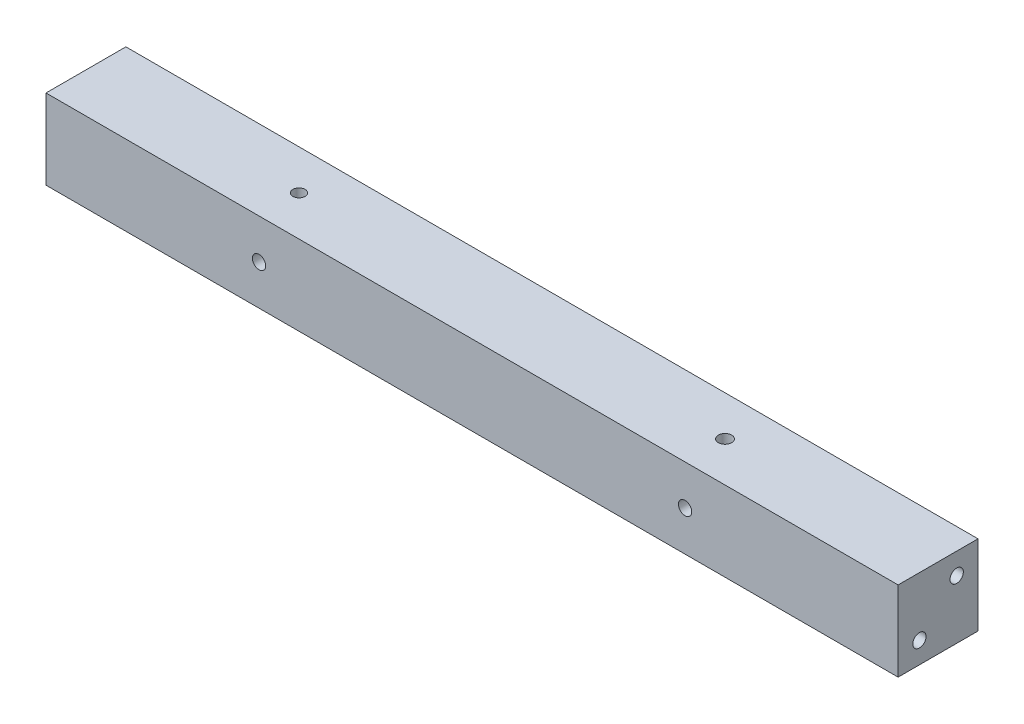
ISO-10303-21;
HEADER;
FILE_DESCRIPTION(('STEP AP214'),'2;1');
FILE_NAME('part.step','',(''),(''),'','','');
FILE_SCHEMA(('AUTOMOTIVE_DESIGN { 1 0 10303 214 1 1 1 1 }'));
ENDSEC;
DATA;
#1=APPLICATION_CONTEXT('core data for automotive mechanical design processes');
#2=APPLICATION_PROTOCOL_DEFINITION('international standard','automotive_design',2000,#1);
#3=PRODUCT_CONTEXT('',#1,'mechanical');
#4=PRODUCT('Part','Part','',(#3));
#5=PRODUCT_RELATED_PRODUCT_CATEGORY('part','',(#4));
#6=PRODUCT_DEFINITION_FORMATION('','',#4);
#7=PRODUCT_DEFINITION_CONTEXT('part definition',#1,'design');
#8=PRODUCT_DEFINITION('design','',#6,#7);
#9=PRODUCT_DEFINITION_SHAPE('','',#8);
#10=(LENGTH_UNIT() NAMED_UNIT(*) SI_UNIT(.MILLI.,.METRE.));
#11=(NAMED_UNIT(*) PLANE_ANGLE_UNIT() SI_UNIT($,.RADIAN.));
#12=(NAMED_UNIT(*) SI_UNIT($,.STERADIAN.) SOLID_ANGLE_UNIT());
#13=UNCERTAINTY_MEASURE_WITH_UNIT(LENGTH_MEASURE(1.E-05),#10,'distance_accuracy_value','');
#14=(GEOMETRIC_REPRESENTATION_CONTEXT(3) GLOBAL_UNCERTAINTY_ASSIGNED_CONTEXT((#13)) GLOBAL_UNIT_ASSIGNED_CONTEXT((#10,
#11,#12)) REPRESENTATION_CONTEXT('',''));
#15=CARTESIAN_POINT('',(0.,0.,0.));
#16=DIRECTION('',(0.,0.,1.));
#17=DIRECTION('',(1.,0.,0.));
#18=AXIS2_PLACEMENT_3D('',#15,#16,#17);
#19=CARTESIAN_POINT('',(120.,7.5,0.));
#20=DIRECTION('',(0.,0.,1.));
#21=DIRECTION('',(1.,0.,0.));
#22=AXIS2_PLACEMENT_3D('',#19,#20,#21);
#23=CYLINDRICAL_SURFACE('',#22,1.25);
#24=CARTESIAN_POINT('',(120.,7.5,15.));
#25=DIRECTION('',(0.,0.,1.));
#26=DIRECTION('',(1.,0.,0.));
#27=AXIS2_PLACEMENT_3D('',#24,#25,#26);
#28=CIRCLE('',#27,1.25);
#29=CARTESIAN_POINT('',(121.25,7.5,15.));
#30=VERTEX_POINT('',#29);
#31=EDGE_CURVE('E117',#30,#30,#28,.T.);
#32=ORIENTED_EDGE('',*,*,#31,.T.);
#33=EDGE_LOOP('',(#32));
#34=FACE_BOUND('',#33,.T.);
#35=CARTESIAN_POINT('',(120.,7.5,7.5));
#36=DIRECTION('',(0.,-0.707106781186547,0.707106781186547));
#37=DIRECTION('',(0.,0.707106781186547,0.707106781186547));
#38=AXIS2_PLACEMENT_3D('',#35,#36,#37);
#39=ELLIPSE('',#38,1.76776695296637,1.25);
#40=CARTESIAN_POINT('',(118.75,7.5,7.5));
#41=VERTEX_POINT('',#40);
#42=CARTESIAN_POINT('',(121.25,7.5,7.5));
#43=VERTEX_POINT('',#42);
#44=EDGE_CURVE('E53',#41,#43,#39,.F.);
#45=ORIENTED_EDGE('',*,*,#44,.T.);
#46=CARTESIAN_POINT('',(120.,7.5,7.5));
#47=DIRECTION('',(0.,0.707106781186547,0.707106781186547));
#48=DIRECTION('',(0.,-0.707106781186547,0.707106781186547));
#49=AXIS2_PLACEMENT_3D('',#46,#47,#48);
#50=ELLIPSE('',#49,1.76776695296637,1.25);
#51=EDGE_CURVE('E11',#43,#41,#50,.F.);
#52=ORIENTED_EDGE('',*,*,#51,.T.);
#53=EDGE_LOOP('',(#45,#52));
#54=FACE_BOUND('',#53,.T.);
#55=ADVANCED_FACE('F40',(#34,#54),#23,.F.);
#56=CARTESIAN_POINT('',(0.,0.,15.));
#57=DIRECTION('',(1.,0.,0.));
#58=DIRECTION('',(0.,0.,-1.));
#59=AXIS2_PLACEMENT_3D('',#56,#57,#58);
#60=PLANE('',#59);
#61=CARTESIAN_POINT('',(0.,11.,4.));
#62=DIRECTION('',(-1.,0.,0.));
#63=DIRECTION('',(0.,0.,1.));
#64=AXIS2_PLACEMENT_3D('',#61,#62,#63);
#65=CIRCLE('',#64,1.25);
#66=CARTESIAN_POINT('',(0.,11.,5.25));
#67=VERTEX_POINT('',#66);
#68=EDGE_CURVE('E251',#67,#67,#65,.T.);
#69=ORIENTED_EDGE('',*,*,#68,.F.);
#70=EDGE_LOOP('',(#69));
#71=FACE_BOUND('',#70,.T.);
#72=CARTESIAN_POINT('',(0.,4.,11.));
#73=DIRECTION('',(-1.,0.,0.));
#74=DIRECTION('',(0.,0.,1.));
#75=AXIS2_PLACEMENT_3D('',#72,#73,#74);
#76=CIRCLE('',#75,1.25);
#77=CARTESIAN_POINT('',(0.,4.,12.25));
#78=VERTEX_POINT('',#77);
#79=EDGE_CURVE('E244',#78,#78,#76,.T.);
#80=ORIENTED_EDGE('',*,*,#79,.F.);
#81=EDGE_LOOP('',(#80));
#82=FACE_BOUND('',#81,.T.);
#83=DIRECTION('',(0.,-1.,0.));
#84=VECTOR('',#83,1.);
#85=CARTESIAN_POINT('',(0.,0.,0.));
#86=LINE('',#85,#84);
#87=CARTESIAN_POINT('',(0.,15.,0.));
#88=VERTEX_POINT('',#87);
#89=CARTESIAN_POINT('',(0.,0.,0.));
#90=VERTEX_POINT('',#89);
#91=EDGE_CURVE('E201',#88,#90,#86,.T.);
#92=ORIENTED_EDGE('',*,*,#91,.T.);
#93=DIRECTION('',(0.,0.,-1.));
#94=VECTOR('',#93,1.);
#95=CARTESIAN_POINT('',(0.,0.,15.));
#96=LINE('',#95,#94);
#97=CARTESIAN_POINT('',(0.,0.,15.));
#98=VERTEX_POINT('',#97);
#99=EDGE_CURVE('E104',#98,#90,#96,.T.);
#100=ORIENTED_EDGE('',*,*,#99,.F.);
#101=DIRECTION('',(0.,-1.,0.));
#102=VECTOR('',#101,1.);
#103=CARTESIAN_POINT('',(0.,0.,15.));
#104=LINE('',#103,#102);
#105=CARTESIAN_POINT('',(0.,15.,15.));
#106=VERTEX_POINT('',#105);
#107=EDGE_CURVE('E209',#106,#98,#104,.T.);
#108=ORIENTED_EDGE('',*,*,#107,.F.);
#109=DIRECTION('',(0.,0.,-1.));
#110=VECTOR('',#109,1.);
#111=CARTESIAN_POINT('',(0.,15.,15.));
#112=LINE('',#111,#110);
#113=EDGE_CURVE('E213',#106,#88,#112,.T.);
#114=ORIENTED_EDGE('',*,*,#113,.T.);
#115=EDGE_LOOP('',(#92,#100,#108,#114));
#116=FACE_BOUND('',#115,.T.);
#117=ADVANCED_FACE('F42',(#71,#82,#116),#60,.F.);
#118=CARTESIAN_POINT('',(0.,0.,15.));
#119=DIRECTION('',(0.,1.,0.));
#120=DIRECTION('',(0.,0.,1.));
#121=AXIS2_PLACEMENT_3D('',#118,#119,#120);
#122=PLANE('',#121);
#123=CARTESIAN_POINT('',(40.,0.,7.5));
#124=DIRECTION('',(0.,1.,0.));
#125=DIRECTION('',(0.,0.,1.));
#126=AXIS2_PLACEMENT_3D('',#123,#124,#125);
#127=CIRCLE('',#126,1.145);
#128=CARTESIAN_POINT('',(40.,0.,8.645));
#129=VERTEX_POINT('',#128);
#130=EDGE_CURVE('E188',#129,#129,#127,.T.);
#131=ORIENTED_EDGE('',*,*,#130,.T.);
#132=EDGE_LOOP('',(#131));
#133=FACE_BOUND('',#132,.T.);
#134=CARTESIAN_POINT('',(120.,0.,7.5));
#135=DIRECTION('',(0.,1.,0.));
#136=DIRECTION('',(0.,0.,1.));
#137=AXIS2_PLACEMENT_3D('',#134,#135,#136);
#138=CIRCLE('',#137,1.25);
#139=CARTESIAN_POINT('',(120.,0.,8.75));
#140=VERTEX_POINT('',#139);
#141=EDGE_CURVE('E190',#140,#140,#138,.T.);
#142=ORIENTED_EDGE('',*,*,#141,.T.);
#143=EDGE_LOOP('',(#142));
#144=FACE_BOUND('',#143,.T.);
#145=DIRECTION('',(1.,0.,0.));
#146=VECTOR('',#145,1.);
#147=CARTESIAN_POINT('',(0.,0.,0.));
#148=LINE('',#147,#146);
#149=CARTESIAN_POINT('',(160.,0.,0.));
#150=VERTEX_POINT('',#149);
#151=EDGE_CURVE('E191',#90,#150,#148,.T.);
#152=ORIENTED_EDGE('',*,*,#151,.T.);
#153=DIRECTION('',(0.,0.,-1.));
#154=VECTOR('',#153,1.);
#155=CARTESIAN_POINT('',(160.,0.,15.));
#156=LINE('',#155,#154);
#157=CARTESIAN_POINT('',(160.,0.,15.));
#158=VERTEX_POINT('',#157);
#159=EDGE_CURVE('E193',#158,#150,#156,.T.);
#160=ORIENTED_EDGE('',*,*,#159,.F.);
#161=DIRECTION('',(1.,0.,0.));
#162=VECTOR('',#161,1.);
#163=CARTESIAN_POINT('',(0.,0.,15.));
#164=LINE('',#163,#162);
#165=EDGE_CURVE('E91',#98,#158,#164,.T.);
#166=ORIENTED_EDGE('',*,*,#165,.F.);
#167=ORIENTED_EDGE('',*,*,#99,.T.);
#168=EDGE_LOOP('',(#152,#160,#166,#167));
#169=FACE_BOUND('',#168,.T.);
#170=ADVANCED_FACE('F153',(#133,#144,#169),#122,.F.);
#171=CARTESIAN_POINT('',(160.,0.,15.));
#172=DIRECTION('',(-1.,0.,0.));
#173=DIRECTION('',(0.,0.,1.));
#174=AXIS2_PLACEMENT_3D('',#171,#172,#173);
#175=PLANE('',#174);
#176=CARTESIAN_POINT('',(160.,11.,4.));
#177=DIRECTION('',(1.,0.,0.));
#178=DIRECTION('',(0.,0.,-1.));
#179=AXIS2_PLACEMENT_3D('',#176,#177,#178);
#180=CIRCLE('',#179,1.25);
#181=CARTESIAN_POINT('',(160.,11.,2.75));
#182=VERTEX_POINT('',#181);
#183=EDGE_CURVE('E262',#182,#182,#180,.T.);
#184=ORIENTED_EDGE('',*,*,#183,.F.);
#185=EDGE_LOOP('',(#184));
#186=FACE_BOUND('',#185,.T.);
#187=CARTESIAN_POINT('',(160.,4.,11.));
#188=DIRECTION('',(1.,0.,0.));
#189=DIRECTION('',(0.,0.,-1.));
#190=AXIS2_PLACEMENT_3D('',#187,#188,#189);
#191=CIRCLE('',#190,1.25);
#192=CARTESIAN_POINT('',(160.,4.,9.75));
#193=VERTEX_POINT('',#192);
#194=EDGE_CURVE('E256',#193,#193,#191,.T.);
#195=ORIENTED_EDGE('',*,*,#194,.F.);
#196=EDGE_LOOP('',(#195));
#197=FACE_BOUND('',#196,.T.);
#198=DIRECTION('',(0.,1.,0.));
#199=VECTOR('',#198,1.);
#200=CARTESIAN_POINT('',(160.,0.,0.));
#201=LINE('',#200,#199);
#202=CARTESIAN_POINT('',(160.,15.,0.));
#203=VERTEX_POINT('',#202);
#204=EDGE_CURVE('E200',#150,#203,#201,.T.);
#205=ORIENTED_EDGE('',*,*,#204,.T.);
#206=DIRECTION('',(0.,0.,-1.));
#207=VECTOR('',#206,1.);
#208=CARTESIAN_POINT('',(160.,15.,15.));
#209=LINE('',#208,#207);
#210=CARTESIAN_POINT('',(160.,15.,15.));
#211=VERTEX_POINT('',#210);
#212=EDGE_CURVE('E206',#211,#203,#209,.T.);
#213=ORIENTED_EDGE('',*,*,#212,.F.);
#214=DIRECTION('',(0.,1.,0.));
#215=VECTOR('',#214,1.);
#216=CARTESIAN_POINT('',(160.,0.,15.));
#217=LINE('',#216,#215);
#218=EDGE_CURVE('E205',#158,#211,#217,.T.);
#219=ORIENTED_EDGE('',*,*,#218,.F.);
#220=ORIENTED_EDGE('',*,*,#159,.T.);
#221=EDGE_LOOP('',(#205,#213,#219,#220));
#222=FACE_BOUND('',#221,.T.);
#223=ADVANCED_FACE('F177',(#186,#197,#222),#175,.F.);
#224=CARTESIAN_POINT('',(0.,15.,15.));
#225=DIRECTION('',(0.,-1.,0.));
#226=DIRECTION('',(0.,0.,-1.));
#227=AXIS2_PLACEMENT_3D('',#224,#225,#226);
#228=PLANE('',#227);
#229=CARTESIAN_POINT('',(40.,15.,7.5));
#230=DIRECTION('',(0.,1.,0.));
#231=DIRECTION('',(0.,0.,1.));
#232=AXIS2_PLACEMENT_3D('',#229,#230,#231);
#233=CIRCLE('',#232,1.145);
#234=CARTESIAN_POINT('',(40.,15.,8.645));
#235=VERTEX_POINT('',#234);
#236=EDGE_CURVE('E240',#235,#235,#233,.T.);
#237=ORIENTED_EDGE('',*,*,#236,.F.);
#238=EDGE_LOOP('',(#237));
#239=FACE_BOUND('',#238,.T.);
#240=CARTESIAN_POINT('',(120.,15.,7.5));
#241=DIRECTION('',(0.,1.,0.));
#242=DIRECTION('',(0.,0.,1.));
#243=AXIS2_PLACEMENT_3D('',#240,#241,#242);
#244=CIRCLE('',#243,1.25);
#245=CARTESIAN_POINT('',(120.,15.,8.75));
#246=VERTEX_POINT('',#245);
#247=EDGE_CURVE('E228',#246,#246,#244,.T.);
#248=ORIENTED_EDGE('',*,*,#247,.F.);
#249=EDGE_LOOP('',(#248));
#250=FACE_BOUND('',#249,.T.);
#251=DIRECTION('',(-1.,0.,0.));
#252=VECTOR('',#251,1.);
#253=CARTESIAN_POINT('',(0.,15.,0.));
#254=LINE('',#253,#252);
#255=EDGE_CURVE('E83',#203,#88,#254,.T.);
#256=ORIENTED_EDGE('',*,*,#255,.T.);
#257=ORIENTED_EDGE('',*,*,#113,.F.);
#258=DIRECTION('',(-1.,0.,0.));
#259=VECTOR('',#258,1.);
#260=CARTESIAN_POINT('',(0.,15.,15.));
#261=LINE('',#260,#259);
#262=EDGE_CURVE('E62',#211,#106,#261,.T.);
#263=ORIENTED_EDGE('',*,*,#262,.F.);
#264=ORIENTED_EDGE('',*,*,#212,.T.);
#265=EDGE_LOOP('',(#256,#257,#263,#264));
#266=FACE_BOUND('',#265,.T.);
#267=ADVANCED_FACE('F170',(#239,#250,#266),#228,.F.);
#268=CARTESIAN_POINT('',(0.,0.,15.));
#269=DIRECTION('',(0.,0.,-1.));
#270=DIRECTION('',(-1.,0.,0.));
#271=AXIS2_PLACEMENT_3D('',#268,#269,#270);
#272=PLANE('',#271);
#273=CARTESIAN_POINT('',(40.,7.5,15.));
#274=DIRECTION('',(0.,0.,1.));
#275=DIRECTION('',(1.,0.,0.));
#276=AXIS2_PLACEMENT_3D('',#273,#274,#275);
#277=CIRCLE('',#276,1.25000000000001);
#278=CARTESIAN_POINT('',(41.25,7.5,15.));
#279=VERTEX_POINT('',#278);
#280=EDGE_CURVE('E221',#279,#279,#277,.T.);
#281=ORIENTED_EDGE('',*,*,#280,.F.);
#282=EDGE_LOOP('',(#281));
#283=FACE_BOUND('',#282,.T.);
#284=ORIENTED_EDGE('',*,*,#31,.F.);
#285=EDGE_LOOP('',(#284));
#286=FACE_BOUND('',#285,.T.);
#287=ORIENTED_EDGE('',*,*,#107,.T.);
#288=ORIENTED_EDGE('',*,*,#165,.T.);
#289=ORIENTED_EDGE('',*,*,#218,.T.);
#290=ORIENTED_EDGE('',*,*,#262,.T.);
#291=EDGE_LOOP('',(#287,#288,#289,#290));
#292=FACE_BOUND('',#291,.T.);
#293=ADVANCED_FACE('F164',(#283,#286,#292),#272,.F.);
#294=CARTESIAN_POINT('',(0.,0.,0.));
#295=DIRECTION('',(0.,0.,-1.));
#296=DIRECTION('',(-1.,0.,0.));
#297=AXIS2_PLACEMENT_3D('',#294,#295,#296);
#298=PLANE('',#297);
#299=CARTESIAN_POINT('',(40.,7.5,0.));
#300=DIRECTION('',(0.,0.,1.));
#301=DIRECTION('',(1.,0.,0.));
#302=AXIS2_PLACEMENT_3D('',#299,#300,#301);
#303=CIRCLE('',#302,1.25000000000001);
#304=CARTESIAN_POINT('',(41.25,7.5,0.));
#305=VERTEX_POINT('',#304);
#306=EDGE_CURVE('E219',#305,#305,#303,.T.);
#307=ORIENTED_EDGE('',*,*,#306,.T.);
#308=EDGE_LOOP('',(#307));
#309=FACE_BOUND('',#308,.T.);
#310=CARTESIAN_POINT('',(120.,7.5,0.));
#311=DIRECTION('',(0.,0.,1.));
#312=DIRECTION('',(1.,0.,0.));
#313=AXIS2_PLACEMENT_3D('',#310,#311,#312);
#314=CIRCLE('',#313,1.25);
#315=CARTESIAN_POINT('',(121.25,7.5,0.));
#316=VERTEX_POINT('',#315);
#317=EDGE_CURVE('E225',#316,#316,#314,.T.);
#318=ORIENTED_EDGE('',*,*,#317,.T.);
#319=EDGE_LOOP('',(#318));
#320=FACE_BOUND('',#319,.T.);
#321=ORIENTED_EDGE('',*,*,#91,.F.);
#322=ORIENTED_EDGE('',*,*,#255,.F.);
#323=ORIENTED_EDGE('',*,*,#204,.F.);
#324=ORIENTED_EDGE('',*,*,#151,.F.);
#325=EDGE_LOOP('',(#321,#322,#323,#324));
#326=FACE_BOUND('',#325,.T.);
#327=ADVANCED_FACE('F158',(#309,#320,#326),#298,.T.);
#328=CARTESIAN_POINT('',(120.,7.5,7.5));
#329=DIRECTION('',(0.,-0.707106781186547,0.707106781186547));
#330=DIRECTION('',(0.,0.707106781186547,0.707106781186547));
#331=AXIS2_PLACEMENT_3D('',#328,#329,#330);
#332=ELLIPSE('',#331,1.76776695296637,1.25);
#333=EDGE_CURVE('E97',#41,#43,#332,.T.);
#334=ORIENTED_EDGE('',*,*,#333,.T.);
#335=CARTESIAN_POINT('',(120.,7.5,7.5));
#336=DIRECTION('',(0.,0.707106781186547,0.707106781186547));
#337=DIRECTION('',(0.,-0.707106781186547,0.707106781186547));
#338=AXIS2_PLACEMENT_3D('',#335,#336,#337);
#339=ELLIPSE('',#338,1.76776695296637,1.25);
#340=EDGE_CURVE('E48',#43,#41,#339,.T.);
#341=ORIENTED_EDGE('',*,*,#340,.T.);
#342=EDGE_LOOP('',(#334,#341));
#343=FACE_BOUND('',#342,.T.);
#344=ORIENTED_EDGE('',*,*,#317,.F.);
#345=EDGE_LOOP('',(#344));
#346=FACE_BOUND('',#345,.T.);
#347=ADVANCED_FACE('F106',(#343,#346),#23,.F.);
#348=CARTESIAN_POINT('',(40.,7.5,0.));
#349=DIRECTION('',(0.,0.,1.));
#350=DIRECTION('',(1.,0.,0.));
#351=AXIS2_PLACEMENT_3D('',#348,#349,#350);
#352=CYLINDRICAL_SURFACE('',#351,1.25000000000001);
#353=CARTESIAN_POINT('',(40.,6.25,8.645));
#354=CARTESIAN_POINT('',(39.9472401217322,6.25000242953519,8.64499753972406));
#355=CARTESIAN_POINT('',(39.8944621024817,6.25336896586556,8.64132496899781));
#356=CARTESIAN_POINT('',(39.7906991540145,6.26653495183679,8.6269291121712));
#357=CARTESIAN_POINT('',(39.7397156706223,6.27633946885662,8.61620027202184));
#358=CARTESIAN_POINT('',(39.6413085539227,6.30149846795534,8.58856027316295));
#359=CARTESIAN_POINT('',(39.5938644269778,6.31681742076215,8.57168868414288));
#360=CARTESIAN_POINT('',(39.5030244245169,6.35200471006577,8.53270915308287));
#361=CARTESIAN_POINT('',(39.4596302688888,6.3718749670884,8.51059900037656));
#362=CARTESIAN_POINT('',(39.360758416355,6.42384191041332,8.45230318628723));
#363=CARTESIAN_POINT('',(39.3074121674083,6.45764638060866,8.41402843967277));
#364=CARTESIAN_POINT('',(39.2095580517728,6.52973772979913,8.33088495453555));
#365=CARTESIAN_POINT('',(39.1650718032831,6.56803521879123,8.28600054125879));
#366=CARTESIAN_POINT('',(39.0837650753719,6.64774797497101,8.18964511783417));
#367=CARTESIAN_POINT('',(39.047158508821,6.68921656368363,8.13803994613549));
#368=CARTESIAN_POINT('',(38.982755753933,6.77170503142999,8.02937691222659));
#369=CARTESIAN_POINT('',(38.954941468144,6.81272566214213,7.9723305692189));
#370=CARTESIAN_POINT('',(38.9202324547965,6.86984569600509,7.88226170391788));
#371=CARTESIAN_POINT('',(38.9099067897385,6.88797742216477,7.85184100888654));
#372=CARTESIAN_POINT('',(38.8915787821573,6.92184010861976,7.78896653564071));
#373=CARTESIAN_POINT('',(38.8835762700495,6.93757124411264,7.75651290603593));
#374=CARTESIAN_POINT('',(38.8713541256471,6.96257965221139,7.69492480275016));
#375=CARTESIAN_POINT('',(38.866726028382,6.9724958927517,7.66614049377992));
#376=CARTESIAN_POINT('',(38.8596463582002,6.98797658923061,7.60720454749161));
#377=CARTESIAN_POINT('',(38.8571871561893,6.99355629066058,7.57705809818295));
#378=CARTESIAN_POINT('',(38.8546957985021,6.999209649152,7.5157880493616));
#379=CARTESIAN_POINT('',(38.8546896700763,6.99922426020858,7.48465747600903));
#380=CARTESIAN_POINT('',(38.8571731123374,6.99358754367646,7.42299484116451));
#381=CARTESIAN_POINT('',(38.8596679743427,6.9879242033041,7.39246418855061));
#382=CARTESIAN_POINT('',(38.8678901732201,6.9699568849336,7.32436788336747));
#383=CARTESIAN_POINT('',(38.8743384205295,6.9562159956849,7.28729035340462));
#384=CARTESIAN_POINT('',(38.8902509986558,6.92443618704079,7.21567885973651));
#385=CARTESIAN_POINT('',(38.8997277311448,6.90637967314913,7.1811560865307));
#386=CARTESIAN_POINT('',(38.9212980181857,6.8680301791695,7.11444967215541));
#387=CARTESIAN_POINT('',(38.933382243533,6.84774529567236,7.08225822454661));
#388=CARTESIAN_POINT('',(38.9600499151448,6.80601106527541,7.01970395440932));
#389=CARTESIAN_POINT('',(38.9746355261237,6.78456072085627,6.98934274679953));
#390=CARTESIAN_POINT('',(39.0221082630459,6.71955390410701,6.90061040865345));
#391=CARTESIAN_POINT('',(39.0586980183801,6.67536703398244,6.84463049270608));
#392=CARTESIAN_POINT('',(39.1450692065905,6.58579078275608,6.73492153170699));
#393=CARTESIAN_POINT('',(39.1956347944803,6.54056018507204,6.68167701425736));
#394=CARTESIAN_POINT('',(39.3088454669008,6.45608738997382,6.58410241786701));
#395=CARTESIAN_POINT('',(39.3714454240478,6.41682377229381,6.53974026165697));
#396=CARTESIAN_POINT('',(39.483337120979,6.36073356794838,6.4769807287626));
#397=CARTESIAN_POINT('',(39.529151915259,6.34094731667728,6.45501527961386));
#398=CARTESIAN_POINT('',(39.6249816954192,6.30649873870799,6.41693160523639));
#399=CARTESIAN_POINT('',(39.674993671564,6.29183277861658,6.40080923340991));
#400=CARTESIAN_POINT('',(39.7785408228491,6.26862309111473,6.37534824444983));
#401=CARTESIAN_POINT('',(39.8320997550022,6.260126440132,6.36606178314783));
#402=CARTESIAN_POINT('',(39.9406395969404,6.25022446685726,6.35524284323627));
#403=CARTESIAN_POINT('',(39.9956196347984,6.24881489540298,6.35370571839709));
#404=CARTESIAN_POINT('',(40.0987114049392,6.25295804818238,6.35822991461346));
#405=CARTESIAN_POINT('',(40.146895622811,6.25774013303434,6.36345016646929));
#406=CARTESIAN_POINT('',(40.2414149326557,6.2726010012877,6.37971246394155));
#407=CARTESIAN_POINT('',(40.2877497885464,6.28268045861809,6.3907552502984));
#408=CARTESIAN_POINT('',(40.3783113204841,6.30767987527394,6.418248781119));
#409=CARTESIAN_POINT('',(40.422487938116,6.32268021855561,6.43478939778045));
#410=CARTESIAN_POINT('',(40.5072134819596,6.35661831996107,6.47242411694128));
#411=CARTESIAN_POINT('',(40.5477607308933,6.37555788525762,6.49352030954478));
#412=CARTESIAN_POINT('',(40.6441079424652,6.42673476798701,6.55096252763162));
#413=CARTESIAN_POINT('',(40.6974760376874,6.46090350231048,6.58967747122862));
#414=CARTESIAN_POINT('',(40.7952855296963,6.53368806132151,6.67372729564309));
#415=CARTESIAN_POINT('',(40.8397023572708,6.57231568017346,6.71907982236986));
#416=CARTESIAN_POINT('',(40.920779586263,6.65266197832555,6.81640461183197));
#417=CARTESIAN_POINT('',(40.9572303872059,6.69443232407773,6.86850866159624));
#418=CARTESIAN_POINT('',(41.0052002981029,6.75652183508645,6.95081917140174));
#419=CARTESIAN_POINT('',(41.0200654309015,6.77711144912993,6.97892975337835));
#420=CARTESIAN_POINT('',(41.0475693862057,6.81758208159835,7.0366992469503));
#421=CARTESIAN_POINT('',(41.0602095188281,6.83746351147531,7.06635723397965));
#422=CARTESIAN_POINT('',(41.0827404012055,6.87499369671283,7.12625978903746));
#423=CARTESIAN_POINT('',(41.092720385749,6.89269975667985,7.15643431556958));
#424=CARTESIAN_POINT('',(41.1103997296799,6.92566503834844,7.21877631421714));
#425=CARTESIAN_POINT('',(41.1180995492208,6.94092475345435,7.25094338263688));
#426=CARTESIAN_POINT('',(41.1298113286102,6.96504512531544,7.31198791950313));
#427=CARTESIAN_POINT('',(41.1342232657178,6.97454749226514,7.34052526965736));
#428=CARTESIAN_POINT('',(41.1409033128704,6.98920975745408,7.39890019954194));
#429=CARTESIAN_POINT('',(41.1431787005855,6.99438439050156,7.42873300055267));
#430=CARTESIAN_POINT('',(41.1453522429074,6.99932232735933,7.48925395526818));
#431=CARTESIAN_POINT('',(41.1452274018213,6.99903328619667,7.51994756682443));
#432=CARTESIAN_POINT('',(41.1425595740828,6.99298321107726,7.5807041812731));
#433=CARTESIAN_POINT('',(41.1400112799976,6.98721016702566,7.61076565203212));
#434=CARTESIAN_POINT('',(41.1316384576284,6.96894475813247,7.67871192867762));
#435=CARTESIAN_POINT('',(41.1250322491857,6.95490398950313,7.71606135760527));
#436=CARTESIAN_POINT('',(41.1087639109748,6.92252988005523,7.78817547586975));
#437=CARTESIAN_POINT('',(41.0990892487171,6.90417901670789,7.82292882982023));
#438=CARTESIAN_POINT('',(41.0770928492866,6.86527985363089,7.89004488869755));
#439=CARTESIAN_POINT('',(41.0647828683334,6.84474151037639,7.92241737994123));
#440=CARTESIAN_POINT('',(41.0376249560927,6.80252742040815,7.98531679811404));
#441=CARTESIAN_POINT('',(41.0227748449377,6.78085070794385,8.01584210912964));
#442=CARTESIAN_POINT('',(40.974443873798,6.71520640134389,8.10503930750022));
#443=CARTESIAN_POINT('',(40.9371959897608,6.67065053152893,8.16129201416944));
#444=CARTESIAN_POINT('',(40.8494343798602,6.58064296462385,8.27121431777935));
#445=CARTESIAN_POINT('',(40.7981666089677,6.53535222693917,8.32441702772689));
#446=CARTESIAN_POINT('',(40.683417820953,6.45096760263753,8.42172382180475));
#447=CARTESIAN_POINT('',(40.619983019832,6.41185125640218,8.46586106720263));
#448=CARTESIAN_POINT('',(40.5071401997118,6.35646619210916,8.52776669618065));
#449=CARTESIAN_POINT('',(40.4612699987499,6.33710698722262,8.54924079715265));
#450=CARTESIAN_POINT('',(40.3654498724821,6.30354261756781,8.58632336371378));
#451=CARTESIAN_POINT('',(40.3155058057989,6.28933020589851,8.60194007786603));
#452=CARTESIAN_POINT('',(40.2214735938602,6.26900365449522,8.62423028036273));
#453=CARTESIAN_POINT('',(40.1778495353824,6.26191884890525,8.63197802143613));
#454=CARTESIAN_POINT('',(40.0894879616512,6.25241611678477,8.64236378725761));
#455=CARTESIAN_POINT('',(40.0447505064061,6.24999793928769,8.64500208678635));
#456=CARTESIAN_POINT('',(40.,6.25,8.645));
#457=B_SPLINE_CURVE_WITH_KNOTS('',3,(#353,#354,#355,#356,#357,#358,#359,#360,#361,#362,#363,
#364,#365,#366,#367,#368,#369,#370,#371,#372,#373,#374,#375,#376,#377,#378,#379,#380,#381,#382,
#383,#384,#385,#386,#387,#388,#389,#390,#391,#392,#393,#394,#395,#396,#397,#398,#399,#400,#401,
#402,#403,#404,#405,#406,#407,#408,#409,#410,#411,#412,#413,#414,#415,#416,#417,#418,#419,#420,
#421,#422,#423,#424,#425,#426,#427,#428,#429,#430,#431,#432,#433,#434,#435,#436,#437,#438,#439,
#440,#441,#442,#443,#444,#445,#446,#447,#448,#449,#450,#451,#452,#453,#454,#455,#456),
.UNSPECIFIED.,.T.,.F.,(4,2,2,2,2,2,2,2,2,2,2,2,2,2,2,2,2,2,2,2,2,2,2,2,2,2,2,2,2,2,2,2,2,2,2,2,
2,2,2,2,2,2,2,2,2,2,2,2,2,2,2,4),(0.,0.158087238274767,0.316299057500942,0.473509252674253,
0.630785908860554,0.85112444205138,1.0719941814548,1.29826173562651,1.52406047631174,
1.63459472692154,1.74512090676621,1.83719855826936,1.92895101960319,2.02167695424864,
2.11459948306359,2.23412320577711,2.35414278978322,2.47373987934299,2.59344099610676,
2.83298917545941,3.09052202678348,3.34710736287121,3.51008211591093,3.67294098477943,
3.83702988928976,4.0010204001535,4.14643311175877,4.29186432717384,4.43980049463522,
4.58780468015724,4.80934880878223,5.03149298349572,5.25892054486218,5.37249397821892,
5.48600031232022,5.59500003693805,5.70397774962068,5.7948681685103,5.88544785459896,
5.97689577947838,6.06854444029665,6.18920102569295,6.31035689629481,6.43098314958719,
6.55171344506635,6.79332227016612,7.05208340891982,7.30988045109727,7.47195272526674,
7.63379589932177,7.76789144106949,7.90197977109245),.UNSPECIFIED.);
#458=CARTESIAN_POINT('',(40.,6.25,8.645));
#459=VERTEX_POINT('',#458);
#460=EDGE_CURVE('E109',#459,#459,#457,.T.);
#461=ORIENTED_EDGE('',*,*,#460,.T.);
#462=EDGE_LOOP('',(#461));
#463=FACE_BOUND('',#462,.T.);
#464=CARTESIAN_POINT('',(40.,8.75,8.645));
#465=CARTESIAN_POINT('',(40.0527598782678,8.74999757046481,8.64499753972406));
#466=CARTESIAN_POINT('',(40.1055378975183,8.74663103413444,8.64132496899781));
#467=CARTESIAN_POINT('',(40.2093008459855,8.73346504816321,8.6269291121712));
#468=CARTESIAN_POINT('',(40.2602843293777,8.72366053114338,8.61620027202184));
#469=CARTESIAN_POINT('',(40.3586914460773,8.69850153204466,8.58856027316295));
#470=CARTESIAN_POINT('',(40.4061355730222,8.68318257923785,8.57168868414288));
#471=CARTESIAN_POINT('',(40.4969755754831,8.64799528993423,8.53270915308287));
#472=CARTESIAN_POINT('',(40.5403697311112,8.6281250329116,8.51059900037656));
#473=CARTESIAN_POINT('',(40.639241583645,8.57615808958668,8.45230318628723));
#474=CARTESIAN_POINT('',(40.6925878325917,8.54235361939134,8.41402843967277));
#475=CARTESIAN_POINT('',(40.7904419482272,8.47026227020087,8.33088495453555));
#476=CARTESIAN_POINT('',(40.8349281967169,8.43196478120876,8.28600054125879));
#477=CARTESIAN_POINT('',(40.9162349246281,8.35225202502899,8.18964511783416));
#478=CARTESIAN_POINT('',(40.952841491179,8.31078343631636,8.13803994613549));
#479=CARTESIAN_POINT('',(41.017244246067,8.22829496857,8.02937691222658));
#480=CARTESIAN_POINT('',(41.045058531856,8.18727433785786,7.97233056921889));
#481=CARTESIAN_POINT('',(41.0797675452035,8.13015430399491,7.88226170391787));
#482=CARTESIAN_POINT('',(41.0900932102615,8.11202257783523,7.85184100888654));
#483=CARTESIAN_POINT('',(41.1084212178427,8.07815989138023,7.78896653564071));
#484=CARTESIAN_POINT('',(41.1164237299505,8.06242875588735,7.75651290603593));
#485=CARTESIAN_POINT('',(41.1286458743529,8.03742034778861,7.69492480275015));
#486=CARTESIAN_POINT('',(41.133273971618,8.02750410724829,7.66614049377992));
#487=CARTESIAN_POINT('',(41.1403536417998,8.01202341076939,7.60720454749161));
#488=CARTESIAN_POINT('',(41.1428128438107,8.00644370933941,7.57705809818294));
#489=CARTESIAN_POINT('',(41.1453042014979,8.00079035084799,7.5157880493616));
#490=CARTESIAN_POINT('',(41.1453103299237,8.00077573979142,7.48465747600902));
#491=CARTESIAN_POINT('',(41.1428268876626,8.00641245632354,7.42299484116451));
#492=CARTESIAN_POINT('',(41.1403320256573,8.0120757966959,7.39246418855061));
#493=CARTESIAN_POINT('',(41.1321098267799,8.0300431150664,7.32436788336747));
#494=CARTESIAN_POINT('',(41.1256615794705,8.0437840043151,7.28729035340462));
#495=CARTESIAN_POINT('',(41.1097490013442,8.07556381295921,7.2156788597365));
#496=CARTESIAN_POINT('',(41.1002722688552,8.09362032685087,7.1811560865307));
#497=CARTESIAN_POINT('',(41.0787019818143,8.13196982083051,7.11444967215541));
#498=CARTESIAN_POINT('',(41.066617756467,8.15225470432765,7.0822582245466));
#499=CARTESIAN_POINT('',(41.0399500848552,8.19398893472459,7.01970395440932));
#500=CARTESIAN_POINT('',(41.0253644738763,8.21543927914373,6.98934274679953));
#501=CARTESIAN_POINT('',(40.9778917369542,8.28044609589299,6.90061040865345));
#502=CARTESIAN_POINT('',(40.9413019816199,8.32463296601757,6.84463049270607));
#503=CARTESIAN_POINT('',(40.8549307934095,8.41420921724392,6.73492153170699));
#504=CARTESIAN_POINT('',(40.8043652055197,8.45943981492796,6.68167701425736));
#505=CARTESIAN_POINT('',(40.6911545330992,8.54391261002618,6.584102417867));
#506=CARTESIAN_POINT('',(40.6285545759522,8.58317622770619,6.53974026165697));
#507=CARTESIAN_POINT('',(40.516662879021,8.63926643205162,6.4769807287626));
#508=CARTESIAN_POINT('',(40.470848084741,8.65905268332273,6.45501527961386));
#509=CARTESIAN_POINT('',(40.3750183045808,8.69350126129202,6.41693160523638));
#510=CARTESIAN_POINT('',(40.325006328436,8.70816722138342,6.40080923340991));
#511=CARTESIAN_POINT('',(40.2214591771509,8.73137690888527,6.37534824444982));
#512=CARTESIAN_POINT('',(40.1679002449978,8.739873559868,6.36606178314783));
#513=CARTESIAN_POINT('',(40.0593604030596,8.74977553314274,6.35524284323627));
#514=CARTESIAN_POINT('',(40.0043803652016,8.75118510459702,6.35370571839709));
#515=CARTESIAN_POINT('',(39.9012885950608,8.74704195181762,6.35822991461346));
#516=CARTESIAN_POINT('',(39.853104377189,8.74225986696566,6.36345016646929));
#517=CARTESIAN_POINT('',(39.7585850673443,8.7273989987123,6.37971246394155));
#518=CARTESIAN_POINT('',(39.7122502114536,8.71731954138191,6.3907552502984));
#519=CARTESIAN_POINT('',(39.6216886795159,8.69232012472606,6.41824878111901));
#520=CARTESIAN_POINT('',(39.577512061884,8.67731978144439,6.43478939778046));
#521=CARTESIAN_POINT('',(39.4927865180404,8.64338168003892,6.47242411694128));
#522=CARTESIAN_POINT('',(39.4522392691067,8.62444211474238,6.49352030954479));
#523=CARTESIAN_POINT('',(39.3558920575348,8.57326523201298,6.55096252763163));
#524=CARTESIAN_POINT('',(39.3025239623126,8.53909649768951,6.58967747122862));
#525=CARTESIAN_POINT('',(39.2047144703037,8.46631193867848,6.6737272956431));
#526=CARTESIAN_POINT('',(39.1602976427292,8.42768431982653,6.71907982236988));
#527=CARTESIAN_POINT('',(39.079220413737,8.34733802167443,6.81640461183198));
#528=CARTESIAN_POINT('',(39.0427696127941,8.30556767592226,6.86850866159626));
#529=CARTESIAN_POINT('',(38.9947997018971,8.24347816491354,6.95081917140175));
#530=CARTESIAN_POINT('',(38.9799345690985,8.22288855087006,6.97892975337837));
#531=CARTESIAN_POINT('',(38.9524306137943,8.18241791840164,7.03669924695032));
#532=CARTESIAN_POINT('',(38.9397904811719,8.16253648852467,7.06635723397967));
#533=CARTESIAN_POINT('',(38.9172595987945,8.12500630328716,7.12625978903747));
#534=CARTESIAN_POINT('',(38.907279614251,8.10730024332014,7.1564343155696));
#535=CARTESIAN_POINT('',(38.8896002703201,8.07433496165156,7.21877631421716));
#536=CARTESIAN_POINT('',(38.8819004507792,8.05907524654564,7.25094338263689));
#537=CARTESIAN_POINT('',(38.8701886713897,8.03495487468455,7.31198791950314));
#538=CARTESIAN_POINT('',(38.8657767342822,8.02545250773485,7.34052526965738));
#539=CARTESIAN_POINT('',(38.8590966871296,8.01079024254592,7.39890019954195));
#540=CARTESIAN_POINT('',(38.8568212994145,8.00561560949844,7.42873300055268));
#541=CARTESIAN_POINT('',(38.8546477570926,8.00067767264067,7.48925395526819));
#542=CARTESIAN_POINT('',(38.8547725981787,8.00096671380333,7.51994756682444));
#543=CARTESIAN_POINT('',(38.8574404259172,8.00701678892274,7.58070418127311));
#544=CARTESIAN_POINT('',(38.8599887200024,8.01278983297434,7.61076565203212));
#545=CARTESIAN_POINT('',(38.8683615423716,8.03105524186753,7.67871192867762));
#546=CARTESIAN_POINT('',(38.8749677508143,8.04509601049687,7.71606135760527));
#547=CARTESIAN_POINT('',(38.8912360890252,8.07747011994477,7.78817547586975));
#548=CARTESIAN_POINT('',(38.9009107512829,8.09582098329211,7.82292882982023));
#549=CARTESIAN_POINT('',(38.9229071507134,8.13472014636911,7.89004488869755));
#550=CARTESIAN_POINT('',(38.9352171316666,8.15525848962361,7.92241737994123));
#551=CARTESIAN_POINT('',(38.9623750439073,8.19747257959185,7.98531679811404));
#552=CARTESIAN_POINT('',(38.9772251550623,8.21914929205615,8.01584210912964));
#553=CARTESIAN_POINT('',(39.025556126202,8.28479359865612,8.10503930750022));
#554=CARTESIAN_POINT('',(39.0628040102392,8.32934946847107,8.16129201416944));
#555=CARTESIAN_POINT('',(39.1505656201398,8.41935703537615,8.27121431777936));
#556=CARTESIAN_POINT('',(39.2018333910323,8.46464777306084,8.3244170277269));
#557=CARTESIAN_POINT('',(39.316582179047,8.54903239736248,8.42172382180476));
#558=CARTESIAN_POINT('',(39.380016980168,8.58814874359783,8.46586106720264));
#559=CARTESIAN_POINT('',(39.4928598002882,8.64353380789085,8.52776669618066));
#560=CARTESIAN_POINT('',(39.5387300012501,8.66289301277739,8.54924079715265));
#561=CARTESIAN_POINT('',(39.634550127518,8.69645738243219,8.58632336371378));
#562=CARTESIAN_POINT('',(39.6844941942011,8.71066979410149,8.60194007786603));
#563=CARTESIAN_POINT('',(39.7785264061398,8.73099634550478,8.62423028036273));
#564=CARTESIAN_POINT('',(39.8221504646176,8.73808115109475,8.63197802143613));
#565=CARTESIAN_POINT('',(39.9105120383488,8.74758388321523,8.64236378725761));
#566=CARTESIAN_POINT('',(39.9552494935939,8.75000206071231,8.64500208678635));
#567=CARTESIAN_POINT('',(40.,8.75,8.645));
#568=B_SPLINE_CURVE_WITH_KNOTS('',3,(#464,#465,#466,#467,#468,#469,#470,#471,#472,#473,#474,
#475,#476,#477,#478,#479,#480,#481,#482,#483,#484,#485,#486,#487,#488,#489,#490,#491,#492,#493,
#494,#495,#496,#497,#498,#499,#500,#501,#502,#503,#504,#505,#506,#507,#508,#509,#510,#511,#512,
#513,#514,#515,#516,#517,#518,#519,#520,#521,#522,#523,#524,#525,#526,#527,#528,#529,#530,#531,
#532,#533,#534,#535,#536,#537,#538,#539,#540,#541,#542,#543,#544,#545,#546,#547,#548,#549,#550,
#551,#552,#553,#554,#555,#556,#557,#558,#559,#560,#561,#562,#563,#564,#565,#566,#567),
.UNSPECIFIED.,.T.,.F.,(4,2,2,2,2,2,2,2,2,2,2,2,2,2,2,2,2,2,2,2,2,2,2,2,2,2,2,2,2,2,2,2,2,2,2,2,
2,2,2,2,2,2,2,2,2,2,2,2,2,2,2,4),(0.,0.158087238274767,0.316299057500942,0.473509252674252,
0.630785908860554,0.851124442051382,1.07199418145482,1.29826173562652,1.52406047631175,
1.63459472692155,1.74512090676621,1.83719855826937,1.92895101960319,2.02167695424864,
2.11459948306359,2.23412320577711,2.35414278978322,2.47373987934299,2.59344099610677,
2.83298917545942,3.09052202678348,3.34710736287122,3.51008211591094,3.67294098477943,
3.83702988928977,4.00102040015351,4.14643311175877,4.29186432717384,4.43980049463523,
4.58780468015725,4.80934880878225,5.03149298349574,5.2589205448622,5.37249397821895,
5.48600031232025,5.59500003693808,5.7039777496207,5.79486816851032,5.88544785459897,
5.97689577947839,6.06854444029665,6.18920102569295,6.31035689629482,6.43098314958719,
6.55171344506635,6.79332227016613,7.05208340891984,7.30988045109728,7.47195272526676,
7.63379589932178,7.76789144106949,7.90197977109245),.UNSPECIFIED.);
#569=CARTESIAN_POINT('',(40.,8.75,8.645));
#570=VERTEX_POINT('',#569);
#571=EDGE_CURVE('E118',#570,#570,#568,.T.);
#572=ORIENTED_EDGE('',*,*,#571,.T.);
#573=EDGE_LOOP('',(#572));
#574=FACE_BOUND('',#573,.T.);
#575=ORIENTED_EDGE('',*,*,#306,.F.);
#576=EDGE_LOOP('',(#575));
#577=FACE_BOUND('',#576,.T.);
#578=ORIENTED_EDGE('',*,*,#280,.T.);
#579=EDGE_LOOP('',(#578));
#580=FACE_BOUND('',#579,.T.);
#581=ADVANCED_FACE('F123',(#463,#574,#577,#580),#352,.F.);
#582=CARTESIAN_POINT('',(40.,0.,7.5));
#583=DIRECTION('',(0.,1.,0.));
#584=DIRECTION('',(0.,0.,1.));
#585=AXIS2_PLACEMENT_3D('',#582,#583,#584);
#586=CYLINDRICAL_SURFACE('',#585,1.145);
#587=ORIENTED_EDGE('',*,*,#236,.T.);
#588=EDGE_LOOP('',(#587));
#589=FACE_BOUND('',#588,.T.);
#590=ORIENTED_EDGE('',*,*,#571,.F.);
#591=EDGE_LOOP('',(#590));
#592=FACE_BOUND('',#591,.T.);
#593=ADVANCED_FACE('F131',(#589,#592),#586,.F.);
#594=ORIENTED_EDGE('',*,*,#130,.F.);
#595=EDGE_LOOP('',(#594));
#596=FACE_BOUND('',#595,.T.);
#597=ORIENTED_EDGE('',*,*,#460,.F.);
#598=EDGE_LOOP('',(#597));
#599=FACE_BOUND('',#598,.T.);
#600=ADVANCED_FACE('F127',(#596,#599),#586,.F.);
#601=CARTESIAN_POINT('',(120.,0.,7.5));
#602=DIRECTION('',(0.,1.,0.));
#603=DIRECTION('',(0.,0.,1.));
#604=AXIS2_PLACEMENT_3D('',#601,#602,#603);
#605=CYLINDRICAL_SURFACE('',#604,1.25);
#606=ORIENTED_EDGE('',*,*,#247,.T.);
#607=EDGE_LOOP('',(#606));
#608=FACE_BOUND('',#607,.T.);
#609=ORIENTED_EDGE('',*,*,#44,.F.);
#610=ORIENTED_EDGE('',*,*,#340,.F.);
#611=EDGE_LOOP('',(#609,#610));
#612=FACE_BOUND('',#611,.T.);
#613=ADVANCED_FACE('F103',(#608,#612),#605,.F.);
#614=ORIENTED_EDGE('',*,*,#141,.F.);
#615=EDGE_LOOP('',(#614));
#616=FACE_BOUND('',#615,.T.);
#617=ORIENTED_EDGE('',*,*,#333,.F.);
#618=ORIENTED_EDGE('',*,*,#51,.F.);
#619=EDGE_LOOP('',(#617,#618));
#620=FACE_BOUND('',#619,.T.);
#621=ADVANCED_FACE('F98',(#616,#620),#605,.F.);
#622=CARTESIAN_POINT('',(10.,4.,11.));
#623=DIRECTION('',(-1.,0.,0.));
#624=DIRECTION('',(0.,0.,1.));
#625=AXIS2_PLACEMENT_3D('',#622,#623,#624);
#626=CYLINDRICAL_SURFACE('',#625,1.25);
#627=CARTESIAN_POINT('',(10.,4.,11.));
#628=DIRECTION('',(-1.,0.,0.));
#629=DIRECTION('',(0.,0.,1.));
#630=AXIS2_PLACEMENT_3D('',#627,#628,#629);
#631=CIRCLE('',#630,1.25);
#632=CARTESIAN_POINT('',(10.,4.,12.25));
#633=VERTEX_POINT('',#632);
#634=EDGE_CURVE('E247',#633,#633,#631,.T.);
#635=ORIENTED_EDGE('',*,*,#634,.F.);
#636=EDGE_LOOP('',(#635));
#637=FACE_BOUND('',#636,.T.);
#638=ORIENTED_EDGE('',*,*,#79,.T.);
#639=EDGE_LOOP('',(#638));
#640=FACE_BOUND('',#639,.T.);
#641=ADVANCED_FACE('F133',(#637,#640),#626,.F.);
#642=CARTESIAN_POINT('',(10.,4.,11.));
#643=DIRECTION('',(-1.,0.,0.));
#644=DIRECTION('',(0.,0.,1.));
#645=AXIS2_PLACEMENT_3D('',#642,#643,#644);
#646=PLANE('',#645);
#647=ORIENTED_EDGE('',*,*,#634,.T.);
#648=EDGE_LOOP('',(#647));
#649=FACE_BOUND('',#648,.T.);
#650=ADVANCED_FACE('F143',(#649),#646,.T.);
#651=CARTESIAN_POINT('',(10.,11.,4.));
#652=DIRECTION('',(-1.,0.,0.));
#653=DIRECTION('',(0.,0.,1.));
#654=AXIS2_PLACEMENT_3D('',#651,#652,#653);
#655=CYLINDRICAL_SURFACE('',#654,1.25);
#656=CARTESIAN_POINT('',(10.,11.,4.));
#657=DIRECTION('',(-1.,0.,0.));
#658=DIRECTION('',(0.,0.,1.));
#659=AXIS2_PLACEMENT_3D('',#656,#657,#658);
#660=CIRCLE('',#659,1.25);
#661=CARTESIAN_POINT('',(10.,11.,5.25));
#662=VERTEX_POINT('',#661);
#663=EDGE_CURVE('E238',#662,#662,#660,.T.);
#664=ORIENTED_EDGE('',*,*,#663,.F.);
#665=EDGE_LOOP('',(#664));
#666=FACE_BOUND('',#665,.T.);
#667=ORIENTED_EDGE('',*,*,#68,.T.);
#668=EDGE_LOOP('',(#667));
#669=FACE_BOUND('',#668,.T.);
#670=ADVANCED_FACE('F290',(#666,#669),#655,.F.);
#671=CARTESIAN_POINT('',(10.,11.,4.));
#672=DIRECTION('',(-1.,0.,0.));
#673=DIRECTION('',(0.,0.,1.));
#674=AXIS2_PLACEMENT_3D('',#671,#672,#673);
#675=PLANE('',#674);
#676=ORIENTED_EDGE('',*,*,#663,.T.);
#677=EDGE_LOOP('',(#676));
#678=FACE_BOUND('',#677,.T.);
#679=ADVANCED_FACE('F281',(#678),#675,.T.);
#680=CARTESIAN_POINT('',(150.,4.,11.));
#681=DIRECTION('',(1.,0.,0.));
#682=DIRECTION('',(0.,0.,-1.));
#683=AXIS2_PLACEMENT_3D('',#680,#681,#682);
#684=CYLINDRICAL_SURFACE('',#683,1.25);
#685=CARTESIAN_POINT('',(150.,4.,11.));
#686=DIRECTION('',(1.,0.,0.));
#687=DIRECTION('',(0.,0.,-1.));
#688=AXIS2_PLACEMENT_3D('',#685,#686,#687);
#689=CIRCLE('',#688,1.25);
#690=CARTESIAN_POINT('',(150.,4.,9.75));
#691=VERTEX_POINT('',#690);
#692=EDGE_CURVE('E259',#691,#691,#689,.T.);
#693=ORIENTED_EDGE('',*,*,#692,.F.);
#694=EDGE_LOOP('',(#693));
#695=FACE_BOUND('',#694,.T.);
#696=ORIENTED_EDGE('',*,*,#194,.T.);
#697=EDGE_LOOP('',(#696));
#698=FACE_BOUND('',#697,.T.);
#699=ADVANCED_FACE('F279',(#695,#698),#684,.F.);
#700=CARTESIAN_POINT('',(150.,4.,11.));
#701=DIRECTION('',(1.,0.,0.));
#702=DIRECTION('',(0.,0.,-1.));
#703=AXIS2_PLACEMENT_3D('',#700,#701,#702);
#704=PLANE('',#703);
#705=ORIENTED_EDGE('',*,*,#692,.T.);
#706=EDGE_LOOP('',(#705));
#707=FACE_BOUND('',#706,.T.);
#708=ADVANCED_FACE('F273',(#707),#704,.T.);
#709=CARTESIAN_POINT('',(150.,11.,4.));
#710=DIRECTION('',(1.,0.,0.));
#711=DIRECTION('',(0.,0.,-1.));
#712=AXIS2_PLACEMENT_3D('',#709,#710,#711);
#713=CYLINDRICAL_SURFACE('',#712,1.25);
#714=CARTESIAN_POINT('',(150.,11.,4.));
#715=DIRECTION('',(1.,0.,0.));
#716=DIRECTION('',(0.,0.,-1.));
#717=AXIS2_PLACEMENT_3D('',#714,#715,#716);
#718=CIRCLE('',#717,1.25);
#719=CARTESIAN_POINT('',(150.,11.,2.75));
#720=VERTEX_POINT('',#719);
#721=EDGE_CURVE('E248',#720,#720,#718,.T.);
#722=ORIENTED_EDGE('',*,*,#721,.F.);
#723=EDGE_LOOP('',(#722));
#724=FACE_BOUND('',#723,.T.);
#725=ORIENTED_EDGE('',*,*,#183,.T.);
#726=EDGE_LOOP('',(#725));
#727=FACE_BOUND('',#726,.T.);
#728=ADVANCED_FACE('F270',(#724,#727),#713,.F.);
#729=CARTESIAN_POINT('',(150.,11.,4.));
#730=DIRECTION('',(1.,0.,0.));
#731=DIRECTION('',(0.,0.,-1.));
#732=AXIS2_PLACEMENT_3D('',#729,#730,#731);
#733=PLANE('',#732);
#734=ORIENTED_EDGE('',*,*,#721,.T.);
#735=EDGE_LOOP('',(#734));
#736=FACE_BOUND('',#735,.T.);
#737=ADVANCED_FACE('F268',(#736),#733,.T.);
#738=CLOSED_SHELL('',(#55,#117,#170,#223,#267,#293,#327,#347,#581,#593,#600,#613,#621,#641,#650,
#670,#679,#699,#708,#728,#737));
#739=MANIFOLD_SOLID_BREP('B2',#738);
#740=ADVANCED_BREP_SHAPE_REPRESENTATION('',(#18,#739),#14);
#741=SHAPE_DEFINITION_REPRESENTATION(#9,#740);
ENDSEC;
END-ISO-10303-21;
